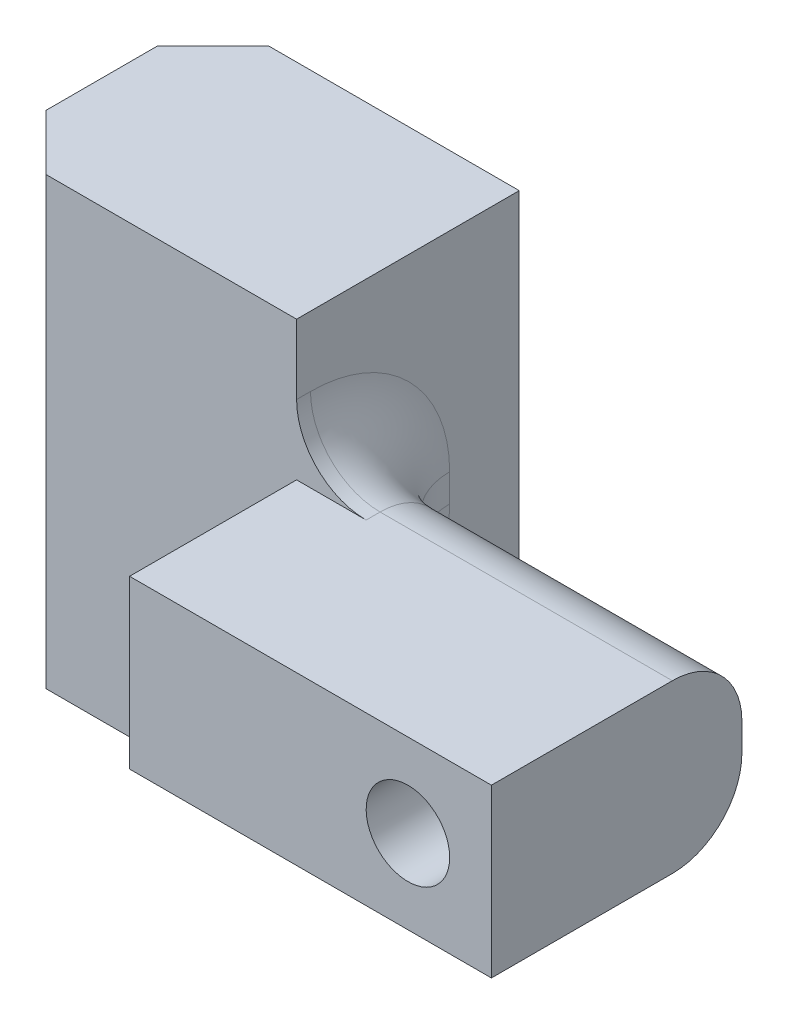
ISO-10303-21;
HEADER;
FILE_DESCRIPTION(('STEP AP214'),'2;1');
FILE_NAME('part.step','',(''),(''),'','','');
FILE_SCHEMA(('AUTOMOTIVE_DESIGN { 1 0 10303 214 1 1 1 1 }'));
ENDSEC;
DATA;
#1=APPLICATION_CONTEXT('core data for automotive mechanical design processes');
#2=APPLICATION_PROTOCOL_DEFINITION('international standard','automotive_design',2000,#1);
#3=PRODUCT_CONTEXT('',#1,'mechanical');
#4=PRODUCT('Part','Part','',(#3));
#5=PRODUCT_RELATED_PRODUCT_CATEGORY('part','',(#4));
#6=PRODUCT_DEFINITION_FORMATION('','',#4);
#7=PRODUCT_DEFINITION_CONTEXT('part definition',#1,'design');
#8=PRODUCT_DEFINITION('design','',#6,#7);
#9=PRODUCT_DEFINITION_SHAPE('','',#8);
#10=(LENGTH_UNIT() NAMED_UNIT(*) SI_UNIT(.MILLI.,.METRE.));
#11=(NAMED_UNIT(*) PLANE_ANGLE_UNIT() SI_UNIT($,.RADIAN.));
#12=(NAMED_UNIT(*) SI_UNIT($,.STERADIAN.) SOLID_ANGLE_UNIT());
#13=UNCERTAINTY_MEASURE_WITH_UNIT(LENGTH_MEASURE(1.E-05),#10,'distance_accuracy_value','');
#14=(GEOMETRIC_REPRESENTATION_CONTEXT(3) GLOBAL_UNCERTAINTY_ASSIGNED_CONTEXT((#13)) GLOBAL_UNIT_ASSIGNED_CONTEXT((#10,
#11,#12)) REPRESENTATION_CONTEXT('',''));
#15=CARTESIAN_POINT('',(0.,0.,0.));
#16=DIRECTION('',(0.,0.,1.));
#17=DIRECTION('',(1.,0.,0.));
#18=AXIS2_PLACEMENT_3D('',#15,#16,#17);
#19=CARTESIAN_POINT('',(0.,0.,0.));
#20=DIRECTION('',(0.,0.,-1.));
#21=DIRECTION('',(-1.,0.,0.));
#22=AXIS2_PLACEMENT_3D('',#19,#20,#21);
#23=PLANE('',#22);
#24=CARTESIAN_POINT('',(0.,0.,0.));
#25=DIRECTION('',(0.,0.,1.));
#26=DIRECTION('',(1.,0.,0.));
#27=AXIS2_PLACEMENT_3D('',#24,#25,#26);
#28=CIRCLE('',#27,1.5);
#29=CARTESIAN_POINT('',(1.41421356237309,-0.5,0.));
#30=VERTEX_POINT('',#29);
#31=CARTESIAN_POINT('',(1.41421356237309,0.500000000000001,0.));
#32=VERTEX_POINT('',#31);
#33=EDGE_CURVE('E211',#30,#32,#28,.T.);
#34=ORIENTED_EDGE('',*,*,#33,.T.);
#35=DIRECTION('',(-1.,0.,0.));
#36=VECTOR('',#35,1.);
#37=CARTESIAN_POINT('',(3.,0.500000000000001,0.));
#38=LINE('',#37,#36);
#39=CARTESIAN_POINT('',(3.,0.500000000000001,0.));
#40=VERTEX_POINT('',#39);
#41=EDGE_CURVE('E277',#32,#40,#38,.F.);
#42=ORIENTED_EDGE('',*,*,#41,.T.);
#43=DIRECTION('',(0.,1.,0.));
#44=VECTOR('',#43,1.);
#45=CARTESIAN_POINT('',(3.,-3.,0.));
#46=LINE('',#45,#44);
#47=CARTESIAN_POINT('',(3.,-0.5,0.));
#48=VERTEX_POINT('',#47);
#49=EDGE_CURVE('E216',#48,#40,#46,.T.);
#50=ORIENTED_EDGE('',*,*,#49,.F.);
#51=DIRECTION('',(1.,0.,0.));
#52=VECTOR('',#51,1.);
#53=CARTESIAN_POINT('',(-10.,-0.5,0.));
#54=LINE('',#53,#52);
#55=EDGE_CURVE('E275',#48,#30,#54,.F.);
#56=ORIENTED_EDGE('',*,*,#55,.T.);
#57=EDGE_LOOP('',(#34,#42,#50,#56));
#58=FACE_BOUND('',#57,.T.);
#59=ADVANCED_FACE('F33',(#58),#23,.T.);
#60=CARTESIAN_POINT('',(0.,0.,9.));
#61=DIRECTION('',(0.,0.,-1.));
#62=DIRECTION('',(-1.,0.,0.));
#63=AXIS2_PLACEMENT_3D('',#60,#61,#62);
#64=PLANE('',#63);
#65=DIRECTION('',(0.,1.,0.));
#66=VECTOR('',#65,1.);
#67=CARTESIAN_POINT('',(3.,-3.,9.));
#68=LINE('',#67,#66);
#69=CARTESIAN_POINT('',(3.,-3.,9.));
#70=VERTEX_POINT('',#69);
#71=CARTESIAN_POINT('',(3.,3.,9.));
#72=VERTEX_POINT('',#71);
#73=EDGE_CURVE('E220',#70,#72,#68,.T.);
#74=ORIENTED_EDGE('',*,*,#73,.T.);
#75=DIRECTION('',(-1.,0.,0.));
#76=VECTOR('',#75,1.);
#77=CARTESIAN_POINT('',(-3.,3.,9.));
#78=LINE('',#77,#76);
#79=CARTESIAN_POINT('',(-10.,3.,9.));
#80=VERTEX_POINT('',#79);
#81=EDGE_CURVE('E223',#72,#80,#78,.T.);
#82=ORIENTED_EDGE('',*,*,#81,.T.);
#83=DIRECTION('',(0.,-1.,0.));
#84=VECTOR('',#83,1.);
#85=CARTESIAN_POINT('',(-10.,3.,9.));
#86=LINE('',#85,#84);
#87=CARTESIAN_POINT('',(-10.,-3.,9.));
#88=VERTEX_POINT('',#87);
#89=EDGE_CURVE('E225',#80,#88,#86,.T.);
#90=ORIENTED_EDGE('',*,*,#89,.T.);
#91=DIRECTION('',(1.,0.,0.));
#92=VECTOR('',#91,1.);
#93=CARTESIAN_POINT('',(-3.,-3.,9.));
#94=LINE('',#93,#92);
#95=EDGE_CURVE('E227',#88,#70,#94,.T.);
#96=ORIENTED_EDGE('',*,*,#95,.T.);
#97=EDGE_LOOP('',(#74,#82,#90,#96));
#98=FACE_BOUND('',#97,.T.);
#99=CARTESIAN_POINT('',(0.,0.,9.));
#100=DIRECTION('',(0.,0.,1.));
#101=DIRECTION('',(1.,0.,0.));
#102=AXIS2_PLACEMENT_3D('',#99,#100,#101);
#103=CIRCLE('',#102,1.5);
#104=CARTESIAN_POINT('',(1.5,0.,9.));
#105=VERTEX_POINT('',#104);
#106=EDGE_CURVE('E213',#105,#105,#103,.T.);
#107=ORIENTED_EDGE('',*,*,#106,.F.);
#108=EDGE_LOOP('',(#107));
#109=FACE_BOUND('',#108,.T.);
#110=ADVANCED_FACE('F321',(#98,#109),#64,.F.);
#111=DIRECTION('',(0.,-1.,0.));
#112=VECTOR('',#111,1.);
#113=CARTESIAN_POINT('',(-7.5,3.,0.));
#114=LINE('',#113,#112);
#115=CARTESIAN_POINT('',(-7.5,-0.5,0.));
#116=VERTEX_POINT('',#115);
#117=CARTESIAN_POINT('',(-7.5,0.499999999999999,0.));
#118=VERTEX_POINT('',#117);
#119=EDGE_CURVE('E269',#116,#118,#114,.F.);
#120=ORIENTED_EDGE('',*,*,#119,.T.);
#121=DIRECTION('',(-1.,0.,0.));
#122=VECTOR('',#121,1.);
#123=CARTESIAN_POINT('',(3.,0.500000000000001,0.));
#124=LINE('',#123,#122);
#125=CARTESIAN_POINT('',(-1.41421356237309,0.5,0.));
#126=VERTEX_POINT('',#125);
#127=EDGE_CURVE('E273',#118,#126,#124,.F.);
#128=ORIENTED_EDGE('',*,*,#127,.T.);
#129=CARTESIAN_POINT('',(-1.41421356237309,-0.5,0.));
#130=VERTEX_POINT('',#129);
#131=EDGE_CURVE('E217',#126,#130,#28,.T.);
#132=ORIENTED_EDGE('',*,*,#131,.T.);
#133=DIRECTION('',(1.,0.,0.));
#134=VECTOR('',#133,1.);
#135=CARTESIAN_POINT('',(-10.,-0.5,0.));
#136=LINE('',#135,#134);
#137=EDGE_CURVE('E271',#130,#116,#136,.F.);
#138=ORIENTED_EDGE('',*,*,#137,.T.);
#139=EDGE_LOOP('',(#120,#128,#132,#138));
#140=FACE_BOUND('',#139,.T.);
#141=ADVANCED_FACE('F324',(#140),#23,.T.);
#142=CARTESIAN_POINT('',(3.,-3.,9.));
#143=DIRECTION('',(-1.,0.,0.));
#144=DIRECTION('',(0.,0.,1.));
#145=AXIS2_PLACEMENT_3D('',#142,#143,#144);
#146=PLANE('',#145);
#147=ORIENTED_EDGE('',*,*,#49,.T.);
#148=CARTESIAN_POINT('',(3.,0.500000000000001,2.5));
#149=DIRECTION('',(-1.,0.,0.));
#150=DIRECTION('',(0.,0.,1.));
#151=AXIS2_PLACEMENT_3D('',#148,#149,#150);
#152=CIRCLE('',#151,2.5);
#153=CARTESIAN_POINT('',(3.,3.,2.5));
#154=VERTEX_POINT('',#153);
#155=EDGE_CURVE('E399',#40,#154,#152,.F.);
#156=ORIENTED_EDGE('',*,*,#155,.T.);
#157=DIRECTION('',(0.,0.,-1.));
#158=VECTOR('',#157,1.);
#159=CARTESIAN_POINT('',(3.,3.,9.));
#160=LINE('',#159,#158);
#161=EDGE_CURVE('E240',#72,#154,#160,.T.);
#162=ORIENTED_EDGE('',*,*,#161,.F.);
#163=ORIENTED_EDGE('',*,*,#73,.F.);
#164=DIRECTION('',(0.,0.,-1.));
#165=VECTOR('',#164,1.);
#166=CARTESIAN_POINT('',(3.,-3.,9.));
#167=LINE('',#166,#165);
#168=CARTESIAN_POINT('',(3.,-3.,2.5));
#169=VERTEX_POINT('',#168);
#170=EDGE_CURVE('E229',#70,#169,#167,.T.);
#171=ORIENTED_EDGE('',*,*,#170,.T.);
#172=CARTESIAN_POINT('',(3.,-0.5,2.5));
#173=DIRECTION('',(-1.,0.,0.));
#174=DIRECTION('',(0.,0.,1.));
#175=AXIS2_PLACEMENT_3D('',#172,#173,#174);
#176=CIRCLE('',#175,2.5);
#177=EDGE_CURVE('E402',#169,#48,#176,.F.);
#178=ORIENTED_EDGE('',*,*,#177,.T.);
#179=EDGE_LOOP('',(#147,#156,#162,#163,#171,#178));
#180=FACE_BOUND('',#179,.T.);
#181=ADVANCED_FACE('F331',(#180),#146,.F.);
#182=CARTESIAN_POINT('',(-3.,3.,9.));
#183=DIRECTION('',(0.,-1.,0.));
#184=DIRECTION('',(1.,0.,0.));
#185=AXIS2_PLACEMENT_3D('',#182,#183,#184);
#186=PLANE('',#185);
#187=DIRECTION('',(0.,0.,-1.));
#188=VECTOR('',#187,1.);
#189=CARTESIAN_POINT('',(-7.5,3.,9.));
#190=LINE('',#189,#188);
#191=CARTESIAN_POINT('',(-7.5,3.,2.5));
#192=VERTEX_POINT('',#191);
#193=CARTESIAN_POINT('',(-7.5,3.,3.));
#194=VERTEX_POINT('',#193);
#195=EDGE_CURVE('E257',#192,#194,#190,.F.);
#196=ORIENTED_EDGE('',*,*,#195,.T.);
#197=DIRECTION('',(-1.,0.,0.));
#198=VECTOR('',#197,1.);
#199=CARTESIAN_POINT('',(-3.,3.,3.));
#200=LINE('',#199,#198);
#201=CARTESIAN_POINT('',(-10.,3.,3.));
#202=VERTEX_POINT('',#201);
#203=EDGE_CURVE('E260',#194,#202,#200,.T.);
#204=ORIENTED_EDGE('',*,*,#203,.T.);
#205=DIRECTION('',(0.,0.,-1.));
#206=VECTOR('',#205,1.);
#207=CARTESIAN_POINT('',(-10.,3.,9.));
#208=LINE('',#207,#206);
#209=EDGE_CURVE('E237',#80,#202,#208,.T.);
#210=ORIENTED_EDGE('',*,*,#209,.F.);
#211=ORIENTED_EDGE('',*,*,#81,.F.);
#212=ORIENTED_EDGE('',*,*,#161,.T.);
#213=DIRECTION('',(-1.,0.,0.));
#214=VECTOR('',#213,1.);
#215=CARTESIAN_POINT('',(-10.,3.,2.5));
#216=LINE('',#215,#214);
#217=EDGE_CURVE('E255',#154,#192,#216,.T.);
#218=ORIENTED_EDGE('',*,*,#217,.T.);
#219=EDGE_LOOP('',(#196,#204,#210,#211,#212,#218));
#220=FACE_BOUND('',#219,.T.);
#221=ADVANCED_FACE('F336',(#220),#186,.F.);
#222=CARTESIAN_POINT('',(-10.,3.,9.));
#223=DIRECTION('',(1.,0.,0.));
#224=DIRECTION('',(0.,0.,-1.));
#225=AXIS2_PLACEMENT_3D('',#222,#223,#224);
#226=PLANE('',#225);
#227=ORIENTED_EDGE('',*,*,#209,.T.);
#228=DIRECTION('',(0.,-1.,0.));
#229=VECTOR('',#228,1.);
#230=CARTESIAN_POINT('',(-10.,8.,3.));
#231=LINE('',#230,#229);
#232=CARTESIAN_POINT('',(-10.,-3.,3.));
#233=VERTEX_POINT('',#232);
#234=EDGE_CURVE('E181',#202,#233,#231,.T.);
#235=ORIENTED_EDGE('',*,*,#234,.T.);
#236=DIRECTION('',(0.,0.,-1.));
#237=VECTOR('',#236,1.);
#238=CARTESIAN_POINT('',(-10.,-3.,9.));
#239=LINE('',#238,#237);
#240=EDGE_CURVE('E234',#88,#233,#239,.T.);
#241=ORIENTED_EDGE('',*,*,#240,.F.);
#242=ORIENTED_EDGE('',*,*,#89,.F.);
#243=EDGE_LOOP('',(#227,#235,#241,#242));
#244=FACE_BOUND('',#243,.T.);
#245=ADVANCED_FACE('F425',(#244),#226,.F.);
#246=CARTESIAN_POINT('',(-3.,-3.,9.));
#247=DIRECTION('',(0.,1.,0.));
#248=DIRECTION('',(0.,0.,1.));
#249=AXIS2_PLACEMENT_3D('',#246,#247,#248);
#250=PLANE('',#249);
#251=ORIENTED_EDGE('',*,*,#240,.T.);
#252=DIRECTION('',(1.,0.,0.));
#253=VECTOR('',#252,1.);
#254=CARTESIAN_POINT('',(-3.,-3.,3.));
#255=LINE('',#254,#253);
#256=CARTESIAN_POINT('',(-7.5,-3.,3.));
#257=VERTEX_POINT('',#256);
#258=EDGE_CURVE('E266',#233,#257,#255,.T.);
#259=ORIENTED_EDGE('',*,*,#258,.T.);
#260=DIRECTION('',(0.,0.,-1.));
#261=VECTOR('',#260,1.);
#262=CARTESIAN_POINT('',(-7.5,-3.,9.));
#263=LINE('',#262,#261);
#264=CARTESIAN_POINT('',(-7.5,-3.,2.5));
#265=VERTEX_POINT('',#264);
#266=EDGE_CURVE('E264',#257,#265,#263,.T.);
#267=ORIENTED_EDGE('',*,*,#266,.T.);
#268=DIRECTION('',(1.,0.,0.));
#269=VECTOR('',#268,1.);
#270=CARTESIAN_POINT('',(3.,-3.,2.5));
#271=LINE('',#270,#269);
#272=EDGE_CURVE('E262',#265,#169,#271,.T.);
#273=ORIENTED_EDGE('',*,*,#272,.T.);
#274=ORIENTED_EDGE('',*,*,#170,.F.);
#275=ORIENTED_EDGE('',*,*,#95,.F.);
#276=EDGE_LOOP('',(#251,#259,#267,#273,#274,#275));
#277=FACE_BOUND('',#276,.T.);
#278=ADVANCED_FACE('F420',(#277),#250,.F.);
#279=CARTESIAN_POINT('',(0.,0.,9.));
#280=DIRECTION('',(0.,0.,-1.));
#281=DIRECTION('',(-1.,0.,0.));
#282=AXIS2_PLACEMENT_3D('',#279,#280,#281);
#283=CYLINDRICAL_SURFACE('',#282,1.5);
#284=ORIENTED_EDGE('',*,*,#106,.T.);
#285=EDGE_LOOP('',(#284));
#286=FACE_BOUND('',#285,.T.);
#287=ORIENTED_EDGE('',*,*,#131,.F.);
#288=CARTESIAN_POINT('',(-1.41421356237309,0.5,0.));
#289=CARTESIAN_POINT('',(-1.40068490551128,0.538271973644592,-3.79228077458756E-06));
#290=CARTESIAN_POINT('',(-1.38560656395206,0.57596691927819,0.000879386960323828));
#291=CARTESIAN_POINT('',(-1.352489948732,0.649931726041284,0.00422623898738818));
#292=CARTESIAN_POINT('',(-1.33445366647011,0.686202525736818,0.00668885166297183));
#293=CARTESIAN_POINT('',(-1.27628655988678,0.792183936408507,0.0161255411330627));
#294=CARTESIAN_POINT('',(-1.23195554242356,0.859462101938222,0.0251524664692449));
#295=CARTESIAN_POINT('',(-1.13362447903287,0.985539558468354,0.0467675682198267));
#296=CARTESIAN_POINT('',(-1.07964505952963,1.04435646315281,0.0593481801966038));
#297=CARTESIAN_POINT('',(-0.963203675156425,1.15263444597581,0.0860444435075559));
#298=CARTESIAN_POINT('',(-0.900730440635611,1.2020828817345,0.100162129198513));
#299=CARTESIAN_POINT('',(-0.764450973735891,1.29335220199358,0.128707682812287));
#300=CARTESIAN_POINT('',(-0.690176900481489,1.33448892593512,0.143098276204687));
#301=CARTESIAN_POINT('',(-0.53531740028397,1.4037885848032,0.168790026119004));
#302=CARTESIAN_POINT('',(-0.454735067362417,1.43195783383457,0.180092685121426));
#303=CARTESIAN_POINT('',(-0.290623256730034,1.47397449872099,0.197416449625339));
#304=CARTESIAN_POINT('',(-0.20715507550835,1.48802777831301,0.203513272350837));
#305=CARTESIAN_POINT('',(-0.0388421420453783,1.50186944018671,0.209515062956219));
#306=CARTESIAN_POINT('',(0.0460018604760755,1.5016653467265,0.209423296834148));
#307=CARTESIAN_POINT('',(0.207838984007759,1.4875827031024,0.203323244746921));
#308=CARTESIAN_POINT('',(0.284942166815956,1.47473509814137,0.197761036918077));
#309=CARTESIAN_POINT('',(0.435817617824731,1.43739562255224,0.182308649259037));
#310=CARTESIAN_POINT('',(0.509589003163167,1.41290068519868,0.172417329634692));
#311=CARTESIAN_POINT('',(0.653987497984677,1.35225647265139,0.149525313944966));
#312=CARTESIAN_POINT('',(0.724479588704687,1.31581572133426,0.136449206087986));
#313=CARTESIAN_POINT('',(0.858760642687472,1.23238960311594,0.109283207519285));
#314=CARTESIAN_POINT('',(0.922544451969805,1.1853962142658,0.095192551129074));
#315=CARTESIAN_POINT('',(1.04665379074477,1.0778526028082,0.0670167201880152));
#316=CARTESIAN_POINT('',(1.10633967354066,1.01653942928296,0.0530147230091779));
#317=CARTESIAN_POINT('',(1.21464600334003,0.884256611329298,0.0287979494723417));
#318=CARTESIAN_POINT('',(1.26328804856941,0.813306256387879,0.018575755963619));
#319=CARTESIAN_POINT('',(1.32707943248037,0.700551955483497,0.00776354518726424));
#320=CARTESIAN_POINT('',(1.34693849236152,0.661566085442509,0.00490875164663716));
#321=CARTESIAN_POINT('',(1.3832044241059,0.581944933959037,0.00102452960814464));
#322=CARTESIAN_POINT('',(1.39961200512392,0.541309993392039,-5.2741829561241E-06));
#323=CARTESIAN_POINT('',(1.41421356237309,0.500000000000001,0.));
#324=B_SPLINE_CURVE_WITH_KNOTS('',3,(#288,#289,#290,#291,#292,#293,#294,#295,#296,#297,#298,
#299,#300,#301,#302,#303,#304,#305,#306,#307,#308,#309,#310,#311,#312,#313,#314,#315,#316,#317,
#318,#319,#320,#321,#322,#323),.UNSPECIFIED.,.F.,.F.,(4,2,2,2,2,2,2,2,2,2,2,2,2,2,2,2,2,4),(0.,
0.121685157507987,0.243288725701847,0.485244478719881,0.726689032272145,0.968457120527421,
1.22558482805404,1.48258720254105,1.73578459287207,1.98884836054248,2.22285455445689,
2.45692239600332,2.6971893681086,2.93763960944022,3.19651719124193,3.45488404433781,
3.58623877948295,3.71756649953589),.UNSPECIFIED.);
#325=EDGE_CURVE('E286',#126,#32,#324,.T.);
#326=ORIENTED_EDGE('',*,*,#325,.T.);
#327=ORIENTED_EDGE('',*,*,#33,.F.);
#328=CARTESIAN_POINT('',(1.41421356237309,-0.5,0.));
#329=CARTESIAN_POINT('',(1.40068490551128,-0.538271973644592,-3.79228077499397E-06));
#330=CARTESIAN_POINT('',(1.38560656395206,-0.57596691927819,0.000879386960323389));
#331=CARTESIAN_POINT('',(1.352489948732,-0.649931726041284,0.00422623898738794));
#332=CARTESIAN_POINT('',(1.33445366647011,-0.686202525736818,0.00668885166297182));
#333=CARTESIAN_POINT('',(1.27628655988678,-0.792183936408507,0.0161255411330631));
#334=CARTESIAN_POINT('',(1.23195554242356,-0.859462101938222,0.025152466469245));
#335=CARTESIAN_POINT('',(1.13362447903287,-0.985539558468354,0.0467675682198265));
#336=CARTESIAN_POINT('',(1.07964505952963,-1.04435646315281,0.0593481801966037));
#337=CARTESIAN_POINT('',(0.963203675156425,-1.15263444597581,0.0860444435075559));
#338=CARTESIAN_POINT('',(0.900730440635611,-1.2020828817345,0.100162129198513));
#339=CARTESIAN_POINT('',(0.764450973735891,-1.29335220199358,0.128707682812287));
#340=CARTESIAN_POINT('',(0.690176900481489,-1.33448892593512,0.143098276204687));
#341=CARTESIAN_POINT('',(0.535317400283971,-1.4037885848032,0.168790026119004));
#342=CARTESIAN_POINT('',(0.454735067362418,-1.43195783383457,0.180092685121426));
#343=CARTESIAN_POINT('',(0.290623256730035,-1.47397449872099,0.197416449625339));
#344=CARTESIAN_POINT('',(0.20715507550835,-1.48802777831301,0.203513272350837));
#345=CARTESIAN_POINT('',(0.0388421420453791,-1.50186944018671,0.209515062956219));
#346=CARTESIAN_POINT('',(-0.0460018604760747,-1.5016653467265,0.209423296834149));
#347=CARTESIAN_POINT('',(-0.207838984007759,-1.4875827031024,0.203323244746922));
#348=CARTESIAN_POINT('',(-0.284942166815955,-1.47473509814137,0.197761036918077));
#349=CARTESIAN_POINT('',(-0.43581761782473,-1.43739562255224,0.182308649259038));
#350=CARTESIAN_POINT('',(-0.509589003163166,-1.41290068519868,0.172417329634692));
#351=CARTESIAN_POINT('',(-0.653987497984676,-1.35225647265139,0.149525313944967));
#352=CARTESIAN_POINT('',(-0.724479588704686,-1.31581572133426,0.136449206087986));
#353=CARTESIAN_POINT('',(-0.858760642687471,-1.23238960311594,0.109283207519285));
#354=CARTESIAN_POINT('',(-0.922544451969804,-1.1853962142658,0.0951925511290743));
#355=CARTESIAN_POINT('',(-1.04665379074477,-1.0778526028082,0.0670167201880158));
#356=CARTESIAN_POINT('',(-1.10633967354066,-1.01653942928296,0.0530147230091785));
#357=CARTESIAN_POINT('',(-1.21464600334003,-0.884256611329299,0.0287979494723419));
#358=CARTESIAN_POINT('',(-1.26328804856941,-0.813306256387879,0.0185757559636188));
#359=CARTESIAN_POINT('',(-1.32707943248037,-0.700551955483497,0.0077635451872639));
#360=CARTESIAN_POINT('',(-1.34693849236152,-0.661566085442509,0.00490875164663688));
#361=CARTESIAN_POINT('',(-1.3832044241059,-0.581944933959037,0.0010245296081446));
#362=CARTESIAN_POINT('',(-1.39961200512392,-0.541309993392038,-5.27418295598332E-06));
#363=CARTESIAN_POINT('',(-1.41421356237309,-0.5,0.));
#364=B_SPLINE_CURVE_WITH_KNOTS('',3,(#328,#329,#330,#331,#332,#333,#334,#335,#336,#337,#338,
#339,#340,#341,#342,#343,#344,#345,#346,#347,#348,#349,#350,#351,#352,#353,#354,#355,#356,#357,
#358,#359,#360,#361,#362,#363),.UNSPECIFIED.,.F.,.F.,(4,2,2,2,2,2,2,2,2,2,2,2,2,2,2,2,2,4),(0.,
0.121685157507987,0.243288725701847,0.485244478719881,0.726689032272145,0.968457120527421,
1.22558482805404,1.48258720254105,1.73578459287207,1.98884836054248,2.22285455445689,
2.45692239600332,2.6971893681086,2.93763960944022,3.19651719124192,3.45488404433781,
3.58623877948295,3.71756649953589),.UNSPECIFIED.);
#365=EDGE_CURVE('E279',#30,#130,#364,.T.);
#366=ORIENTED_EDGE('',*,*,#365,.T.);
#367=EDGE_LOOP('',(#287,#326,#327,#366));
#368=FACE_BOUND('',#367,.T.);
#369=ADVANCED_FACE('F292',(#286,#368),#283,.F.);
#370=CARTESIAN_POINT('',(-10.,8.,3.));
#371=DIRECTION('',(1.,0.,0.));
#372=DIRECTION('',(0.,0.,-1.));
#373=AXIS2_PLACEMENT_3D('',#370,#371,#372);
#374=PLANE('',#373);
#375=CARTESIAN_POINT('',(-10.,8.,3.));
#376=VERTEX_POINT('',#375);
#377=CARTESIAN_POINT('',(-10.,5.5,3.));
#378=VERTEX_POINT('',#377);
#379=EDGE_CURVE('E178',#376,#378,#231,.T.);
#380=ORIENTED_EDGE('',*,*,#379,.T.);
#381=DIRECTION('',(0.,0.,-1.));
#382=VECTOR('',#381,1.);
#383=CARTESIAN_POINT('',(-10.,5.5,3.));
#384=LINE('',#383,#382);
#385=CARTESIAN_POINT('',(-10.,5.5,2.5));
#386=VERTEX_POINT('',#385);
#387=EDGE_CURVE('E252',#378,#386,#384,.T.);
#388=ORIENTED_EDGE('',*,*,#387,.T.);
#389=CARTESIAN_POINT('',(-10.,0.499999999999999,2.5));
#390=DIRECTION('',(1.,0.,0.));
#391=DIRECTION('',(0.,0.,-1.));
#392=AXIS2_PLACEMENT_3D('',#389,#390,#391);
#393=CIRCLE('',#392,5.);
#394=CARTESIAN_POINT('',(-10.,0.499999999999999,-2.5));
#395=VERTEX_POINT('',#394);
#396=EDGE_CURVE('E249',#395,#386,#393,.T.);
#397=ORIENTED_EDGE('',*,*,#396,.F.);
#398=DIRECTION('',(0.,-1.,0.));
#399=VECTOR('',#398,1.);
#400=CARTESIAN_POINT('',(-10.,-3.,-2.5));
#401=LINE('',#400,#399);
#402=CARTESIAN_POINT('',(-10.,-0.5,-2.5));
#403=VERTEX_POINT('',#402);
#404=EDGE_CURVE('E246',#395,#403,#401,.T.);
#405=ORIENTED_EDGE('',*,*,#404,.T.);
#406=CARTESIAN_POINT('',(-10.,-0.5,2.5));
#407=DIRECTION('',(1.,0.,0.));
#408=DIRECTION('',(0.,0.,-1.));
#409=AXIS2_PLACEMENT_3D('',#406,#407,#408);
#410=CIRCLE('',#409,5.);
#411=CARTESIAN_POINT('',(-10.,-5.5,2.5));
#412=VERTEX_POINT('',#411);
#413=EDGE_CURVE('E243',#412,#403,#410,.T.);
#414=ORIENTED_EDGE('',*,*,#413,.F.);
#415=DIRECTION('',(0.,0.,-1.));
#416=VECTOR('',#415,1.);
#417=CARTESIAN_POINT('',(-10.,-5.5,3.));
#418=LINE('',#417,#416);
#419=CARTESIAN_POINT('',(-10.,-5.5,3.));
#420=VERTEX_POINT('',#419);
#421=EDGE_CURVE('E175',#412,#420,#418,.F.);
#422=ORIENTED_EDGE('',*,*,#421,.T.);
#423=CARTESIAN_POINT('',(-10.,-8.,3.));
#424=VERTEX_POINT('',#423);
#425=EDGE_CURVE('E167',#420,#424,#231,.T.);
#426=ORIENTED_EDGE('',*,*,#425,.T.);
#427=DIRECTION('',(0.,0.,1.));
#428=VECTOR('',#427,1.);
#429=CARTESIAN_POINT('',(-10.,-8.,3.));
#430=LINE('',#429,#428);
#431=CARTESIAN_POINT('',(-10.,-8.,-5.));
#432=VERTEX_POINT('',#431);
#433=EDGE_CURVE('E173',#432,#424,#430,.T.);
#434=ORIENTED_EDGE('',*,*,#433,.F.);
#435=DIRECTION('',(0.,-1.,0.));
#436=VECTOR('',#435,1.);
#437=CARTESIAN_POINT('',(-10.,8.,-5.));
#438=LINE('',#437,#436);
#439=CARTESIAN_POINT('',(-10.,8.,-5.));
#440=VERTEX_POINT('',#439);
#441=EDGE_CURVE('E210',#440,#432,#438,.T.);
#442=ORIENTED_EDGE('',*,*,#441,.F.);
#443=DIRECTION('',(0.,0.,1.));
#444=VECTOR('',#443,1.);
#445=CARTESIAN_POINT('',(-10.,8.,3.));
#446=LINE('',#445,#444);
#447=EDGE_CURVE('E201',#440,#376,#446,.T.);
#448=ORIENTED_EDGE('',*,*,#447,.T.);
#449=EDGE_LOOP('',(#380,#388,#397,#405,#414,#422,#426,#434,#442,#448));
#450=FACE_BOUND('',#449,.T.);
#451=ADVANCED_FACE('F170',(#450),#374,.T.);
#452=CARTESIAN_POINT('',(-10.,8.,-5.));
#453=DIRECTION('',(0.,0.,-1.));
#454=DIRECTION('',(-1.,0.,0.));
#455=AXIS2_PLACEMENT_3D('',#452,#453,#454);
#456=PLANE('',#455);
#457=DIRECTION('',(1.,0.,0.));
#458=VECTOR('',#457,1.);
#459=CARTESIAN_POINT('',(-10.,-8.,-5.));
#460=LINE('',#459,#458);
#461=CARTESIAN_POINT('',(-19.,-8.,-5.));
#462=VERTEX_POINT('',#461);
#463=EDGE_CURVE('E191',#462,#432,#460,.T.);
#464=ORIENTED_EDGE('',*,*,#463,.F.);
#465=DIRECTION('',(0.,1.,0.));
#466=VECTOR('',#465,1.);
#467=CARTESIAN_POINT('',(-19.,8.,-5.));
#468=LINE('',#467,#466);
#469=CARTESIAN_POINT('',(-19.,8.,-5.));
#470=VERTEX_POINT('',#469);
#471=EDGE_CURVE('E56',#462,#470,#468,.T.);
#472=ORIENTED_EDGE('',*,*,#471,.T.);
#473=DIRECTION('',(1.,0.,0.));
#474=VECTOR('',#473,1.);
#475=CARTESIAN_POINT('',(-10.,8.,-5.));
#476=LINE('',#475,#474);
#477=EDGE_CURVE('E179',#470,#440,#476,.T.);
#478=ORIENTED_EDGE('',*,*,#477,.T.);
#479=ORIENTED_EDGE('',*,*,#441,.T.);
#480=EDGE_LOOP('',(#464,#472,#478,#479));
#481=FACE_BOUND('',#480,.T.);
#482=ADVANCED_FACE('F391',(#481),#456,.T.);
#483=CARTESIAN_POINT('',(-21.,8.,3.));
#484=DIRECTION('',(-1.,0.,0.));
#485=DIRECTION('',(0.,0.,1.));
#486=AXIS2_PLACEMENT_3D('',#483,#484,#485);
#487=PLANE('',#486);
#488=DIRECTION('',(0.,0.,-1.));
#489=VECTOR('',#488,1.);
#490=CARTESIAN_POINT('',(-21.,8.,3.));
#491=LINE('',#490,#489);
#492=CARTESIAN_POINT('',(-21.,8.,0.999999999999993));
#493=VERTEX_POINT('',#492);
#494=CARTESIAN_POINT('',(-21.,8.,-3.));
#495=VERTEX_POINT('',#494);
#496=EDGE_CURVE('E206',#493,#495,#491,.T.);
#497=ORIENTED_EDGE('',*,*,#496,.T.);
#498=DIRECTION('',(0.,-1.,0.));
#499=VECTOR('',#498,1.);
#500=CARTESIAN_POINT('',(-21.,8.,-3.));
#501=LINE('',#500,#499);
#502=CARTESIAN_POINT('',(-21.,-8.,-3.));
#503=VERTEX_POINT('',#502);
#504=EDGE_CURVE('E375',#495,#503,#501,.T.);
#505=ORIENTED_EDGE('',*,*,#504,.T.);
#506=DIRECTION('',(0.,0.,-1.));
#507=VECTOR('',#506,1.);
#508=CARTESIAN_POINT('',(-21.,-8.,3.));
#509=LINE('',#508,#507);
#510=CARTESIAN_POINT('',(-21.,-8.,0.999999999999993));
#511=VERTEX_POINT('',#510);
#512=EDGE_CURVE('E187',#511,#503,#509,.T.);
#513=ORIENTED_EDGE('',*,*,#512,.F.);
#514=DIRECTION('',(0.,1.,0.));
#515=VECTOR('',#514,1.);
#516=CARTESIAN_POINT('',(-21.,8.,0.999999999999993));
#517=LINE('',#516,#515);
#518=EDGE_CURVE('E373',#511,#493,#517,.T.);
#519=ORIENTED_EDGE('',*,*,#518,.T.);
#520=EDGE_LOOP('',(#497,#505,#513,#519));
#521=FACE_BOUND('',#520,.T.);
#522=ADVANCED_FACE('F388',(#521),#487,.T.);
#523=CARTESIAN_POINT('',(-10.,8.,3.));
#524=DIRECTION('',(0.,0.,1.));
#525=DIRECTION('',(1.,0.,0.));
#526=AXIS2_PLACEMENT_3D('',#523,#524,#525);
#527=PLANE('',#526);
#528=DIRECTION('',(-1.,0.,0.));
#529=VECTOR('',#528,1.);
#530=CARTESIAN_POINT('',(-10.,8.,3.));
#531=LINE('',#530,#529);
#532=CARTESIAN_POINT('',(-19.,8.,3.));
#533=VERTEX_POINT('',#532);
#534=EDGE_CURVE('E204',#376,#533,#531,.T.);
#535=ORIENTED_EDGE('',*,*,#534,.T.);
#536=DIRECTION('',(0.,-1.,0.));
#537=VECTOR('',#536,1.);
#538=CARTESIAN_POINT('',(-19.,8.,3.));
#539=LINE('',#538,#537);
#540=CARTESIAN_POINT('',(-19.,-8.,3.));
#541=VERTEX_POINT('',#540);
#542=EDGE_CURVE('E11',#533,#541,#539,.T.);
#543=ORIENTED_EDGE('',*,*,#542,.T.);
#544=DIRECTION('',(-1.,0.,0.));
#545=VECTOR('',#544,1.);
#546=CARTESIAN_POINT('',(-10.,-8.,3.));
#547=LINE('',#546,#545);
#548=EDGE_CURVE('E183',#424,#541,#547,.T.);
#549=ORIENTED_EDGE('',*,*,#548,.F.);
#550=ORIENTED_EDGE('',*,*,#425,.F.);
#551=CARTESIAN_POINT('',(-7.5,-5.5,3.));
#552=DIRECTION('',(0.,0.,1.));
#553=DIRECTION('',(1.,0.,0.));
#554=AXIS2_PLACEMENT_3D('',#551,#552,#553);
#555=CIRCLE('',#554,2.5);
#556=EDGE_CURVE('E376',#420,#257,#555,.F.);
#557=ORIENTED_EDGE('',*,*,#556,.T.);
#558=ORIENTED_EDGE('',*,*,#258,.F.);
#559=ORIENTED_EDGE('',*,*,#234,.F.);
#560=ORIENTED_EDGE('',*,*,#203,.F.);
#561=CARTESIAN_POINT('',(-7.5,5.5,3.));
#562=DIRECTION('',(0.,0.,1.));
#563=DIRECTION('',(1.,0.,0.));
#564=AXIS2_PLACEMENT_3D('',#561,#562,#563);
#565=CIRCLE('',#564,2.5);
#566=EDGE_CURVE('E393',#194,#378,#565,.F.);
#567=ORIENTED_EDGE('',*,*,#566,.T.);
#568=ORIENTED_EDGE('',*,*,#379,.F.);
#569=EDGE_LOOP('',(#535,#543,#549,#550,#557,#558,#559,#560,#567,#568));
#570=FACE_BOUND('',#569,.T.);
#571=ADVANCED_FACE('F184',(#570),#527,.T.);
#572=CARTESIAN_POINT('',(0.,8.,0.));
#573=DIRECTION('',(0.,1.,0.));
#574=DIRECTION('',(0.,0.,1.));
#575=AXIS2_PLACEMENT_3D('',#572,#573,#574);
#576=PLANE('',#575);
#577=ORIENTED_EDGE('',*,*,#477,.F.);
#578=DIRECTION('',(0.707106781186549,0.,-0.707106781186546));
#579=VECTOR('',#578,1.);
#580=CARTESIAN_POINT('',(-12.,8.,-12.));
#581=LINE('',#580,#579);
#582=EDGE_CURVE('E41',#470,#495,#581,.F.);
#583=ORIENTED_EDGE('',*,*,#582,.T.);
#584=ORIENTED_EDGE('',*,*,#496,.F.);
#585=DIRECTION('',(-0.707106781186546,0.,-0.707106781186549));
#586=VECTOR('',#585,1.);
#587=CARTESIAN_POINT('',(-11.,8.,11.));
#588=LINE('',#587,#586);
#589=EDGE_CURVE('E48',#493,#533,#588,.F.);
#590=ORIENTED_EDGE('',*,*,#589,.T.);
#591=ORIENTED_EDGE('',*,*,#534,.F.);
#592=ORIENTED_EDGE('',*,*,#447,.F.);
#593=EDGE_LOOP('',(#577,#583,#584,#590,#591,#592));
#594=FACE_BOUND('',#593,.T.);
#595=ADVANCED_FACE('F384',(#594),#576,.T.);
#596=CARTESIAN_POINT('',(0.,-8.,0.));
#597=DIRECTION('',(0.,1.,0.));
#598=DIRECTION('',(0.,0.,1.));
#599=AXIS2_PLACEMENT_3D('',#596,#597,#598);
#600=PLANE('',#599);
#601=ORIENTED_EDGE('',*,*,#512,.T.);
#602=DIRECTION('',(-0.707106781186549,0.,0.707106781186546));
#603=VECTOR('',#602,1.);
#604=CARTESIAN_POINT('',(-21.,-8.,-3.));
#605=LINE('',#604,#603);
#606=EDGE_CURVE('E381',#503,#462,#605,.F.);
#607=ORIENTED_EDGE('',*,*,#606,.T.);
#608=ORIENTED_EDGE('',*,*,#463,.T.);
#609=ORIENTED_EDGE('',*,*,#433,.T.);
#610=ORIENTED_EDGE('',*,*,#548,.T.);
#611=DIRECTION('',(0.707106781186546,0.,0.707106781186549));
#612=VECTOR('',#611,1.);
#613=CARTESIAN_POINT('',(-19.,-8.,3.));
#614=LINE('',#613,#612);
#615=EDGE_CURVE('E379',#541,#511,#614,.F.);
#616=ORIENTED_EDGE('',*,*,#615,.T.);
#617=EDGE_LOOP('',(#601,#607,#608,#609,#610,#616));
#618=FACE_BOUND('',#617,.T.);
#619=ADVANCED_FACE('F190',(#618),#600,.F.);
#620=CARTESIAN_POINT('',(-7.5,-5.5,9.));
#621=DIRECTION('',(0.,0.,-1.));
#622=DIRECTION('',(-1.,0.,0.));
#623=AXIS2_PLACEMENT_3D('',#620,#621,#622);
#624=CYLINDRICAL_SURFACE('',#623,2.5);
#625=ORIENTED_EDGE('',*,*,#556,.F.);
#626=ORIENTED_EDGE('',*,*,#421,.F.);
#627=CARTESIAN_POINT('',(-7.5,-5.5,2.5));
#628=DIRECTION('',(0.,0.,1.));
#629=DIRECTION('',(1.,0.,0.));
#630=AXIS2_PLACEMENT_3D('',#627,#628,#629);
#631=CIRCLE('',#630,2.5);
#632=EDGE_CURVE('E193',#265,#412,#631,.T.);
#633=ORIENTED_EDGE('',*,*,#632,.F.);
#634=ORIENTED_EDGE('',*,*,#266,.F.);
#635=EDGE_LOOP('',(#625,#626,#633,#634));
#636=FACE_BOUND('',#635,.T.);
#637=ADVANCED_FACE('F302',(#636),#624,.F.);
#638=CARTESIAN_POINT('',(-3.,-0.5,2.5));
#639=DIRECTION('',(-1.,0.,0.));
#640=DIRECTION('',(0.,0.,1.));
#641=AXIS2_PLACEMENT_3D('',#638,#639,#640);
#642=CYLINDRICAL_SURFACE('',#641,2.5);
#643=ORIENTED_EDGE('',*,*,#177,.F.);
#644=ORIENTED_EDGE('',*,*,#272,.F.);
#645=CARTESIAN_POINT('',(-7.5,-0.5,2.5));
#646=DIRECTION('',(1.,0.,0.));
#647=DIRECTION('',(0.,0.,-1.));
#648=AXIS2_PLACEMENT_3D('',#645,#646,#647);
#649=CIRCLE('',#648,2.5);
#650=EDGE_CURVE('E196',#116,#265,#649,.F.);
#651=ORIENTED_EDGE('',*,*,#650,.F.);
#652=ORIENTED_EDGE('',*,*,#137,.F.);
#653=ORIENTED_EDGE('',*,*,#365,.F.);
#654=ORIENTED_EDGE('',*,*,#55,.F.);
#655=EDGE_LOOP('',(#643,#644,#651,#652,#653,#654));
#656=FACE_BOUND('',#655,.T.);
#657=ADVANCED_FACE('F296',(#656),#642,.T.);
#658=CARTESIAN_POINT('',(-7.5,-0.5,2.5));
#659=DIRECTION('',(1.,0.,0.));
#660=DIRECTION('',(0.,0.,-1.));
#661=AXIS2_PLACEMENT_3D('',#658,#659,#660);
#662=TOROIDAL_SURFACE('',#661,5.,2.5);
#663=ORIENTED_EDGE('',*,*,#632,.T.);
#664=ORIENTED_EDGE('',*,*,#413,.T.);
#665=CARTESIAN_POINT('',(-7.5,-0.5,-2.5));
#666=DIRECTION('',(0.,1.,0.));
#667=DIRECTION('',(0.,0.,1.));
#668=AXIS2_PLACEMENT_3D('',#665,#666,#667);
#669=CIRCLE('',#668,2.5);
#670=EDGE_CURVE('E362',#116,#403,#669,.F.);
#671=ORIENTED_EDGE('',*,*,#670,.F.);
#672=ORIENTED_EDGE('',*,*,#650,.T.);
#673=EDGE_LOOP('',(#663,#664,#671,#672));
#674=FACE_BOUND('',#673,.T.);
#675=ADVANCED_FACE('F301',(#674),#662,.F.);
#676=CARTESIAN_POINT('',(-7.5,8.,-2.5));
#677=DIRECTION('',(0.,1.,0.));
#678=DIRECTION('',(0.,0.,1.));
#679=AXIS2_PLACEMENT_3D('',#676,#677,#678);
#680=CYLINDRICAL_SURFACE('',#679,2.5);
#681=ORIENTED_EDGE('',*,*,#670,.T.);
#682=ORIENTED_EDGE('',*,*,#404,.F.);
#683=CARTESIAN_POINT('',(-7.5,0.499999999999999,-2.5));
#684=DIRECTION('',(0.,-1.,0.));
#685=DIRECTION('',(0.,0.,-1.));
#686=AXIS2_PLACEMENT_3D('',#683,#684,#685);
#687=CIRCLE('',#686,2.5);
#688=EDGE_CURVE('E359',#118,#395,#687,.T.);
#689=ORIENTED_EDGE('',*,*,#688,.F.);
#690=ORIENTED_EDGE('',*,*,#119,.F.);
#691=EDGE_LOOP('',(#681,#682,#689,#690));
#692=FACE_BOUND('',#691,.T.);
#693=ADVANCED_FACE('F360',(#692),#680,.F.);
#694=CARTESIAN_POINT('',(-3.,0.5,2.5));
#695=DIRECTION('',(1.,0.,0.));
#696=DIRECTION('',(0.,1.,0.));
#697=AXIS2_PLACEMENT_3D('',#694,#695,#696);
#698=CYLINDRICAL_SURFACE('',#697,2.5);
#699=ORIENTED_EDGE('',*,*,#325,.F.);
#700=ORIENTED_EDGE('',*,*,#127,.F.);
#701=CARTESIAN_POINT('',(-7.5,0.499999999999999,2.5));
#702=DIRECTION('',(1.,0.,0.));
#703=DIRECTION('',(0.,0.,-1.));
#704=AXIS2_PLACEMENT_3D('',#701,#702,#703);
#705=CIRCLE('',#704,2.5);
#706=EDGE_CURVE('E354',#192,#118,#705,.F.);
#707=ORIENTED_EDGE('',*,*,#706,.F.);
#708=ORIENTED_EDGE('',*,*,#217,.F.);
#709=ORIENTED_EDGE('',*,*,#155,.F.);
#710=ORIENTED_EDGE('',*,*,#41,.F.);
#711=EDGE_LOOP('',(#699,#700,#707,#708,#709,#710));
#712=FACE_BOUND('',#711,.T.);
#713=ADVANCED_FACE('F351',(#712),#698,.T.);
#714=CARTESIAN_POINT('',(-7.5,0.499999999999999,2.5));
#715=DIRECTION('',(1.,0.,0.));
#716=DIRECTION('',(0.,0.,-1.));
#717=AXIS2_PLACEMENT_3D('',#714,#715,#716);
#718=TOROIDAL_SURFACE('',#717,5.,2.5);
#719=ORIENTED_EDGE('',*,*,#688,.T.);
#720=ORIENTED_EDGE('',*,*,#396,.T.);
#721=CARTESIAN_POINT('',(-7.5,5.5,2.5));
#722=DIRECTION('',(0.,0.,1.));
#723=DIRECTION('',(1.,0.,0.));
#724=AXIS2_PLACEMENT_3D('',#721,#722,#723);
#725=CIRCLE('',#724,2.5);
#726=EDGE_CURVE('E365',#192,#386,#725,.F.);
#727=ORIENTED_EDGE('',*,*,#726,.F.);
#728=ORIENTED_EDGE('',*,*,#706,.T.);
#729=EDGE_LOOP('',(#719,#720,#727,#728));
#730=FACE_BOUND('',#729,.T.);
#731=ADVANCED_FACE('F316',(#730),#718,.F.);
#732=CARTESIAN_POINT('',(-7.5,5.5,3.));
#733=DIRECTION('',(0.,0.,-1.));
#734=DIRECTION('',(-1.,0.,0.));
#735=AXIS2_PLACEMENT_3D('',#732,#733,#734);
#736=CYLINDRICAL_SURFACE('',#735,2.5);
#737=ORIENTED_EDGE('',*,*,#566,.F.);
#738=ORIENTED_EDGE('',*,*,#195,.F.);
#739=ORIENTED_EDGE('',*,*,#726,.T.);
#740=ORIENTED_EDGE('',*,*,#387,.F.);
#741=EDGE_LOOP('',(#737,#738,#739,#740));
#742=FACE_BOUND('',#741,.T.);
#743=ADVANCED_FACE('F309',(#742),#736,.F.);
#744=CARTESIAN_POINT('',(-21.,8.,-3.));
#745=DIRECTION('',(0.707106781186546,0.,0.707106781186549));
#746=DIRECTION('',(0.,-1.,0.));
#747=AXIS2_PLACEMENT_3D('',#744,#745,#746);
#748=PLANE('',#747);
#749=ORIENTED_EDGE('',*,*,#582,.F.);
#750=ORIENTED_EDGE('',*,*,#471,.F.);
#751=ORIENTED_EDGE('',*,*,#606,.F.);
#752=ORIENTED_EDGE('',*,*,#504,.F.);
#753=EDGE_LOOP('',(#749,#750,#751,#752));
#754=FACE_BOUND('',#753,.T.);
#755=ADVANCED_FACE('F307',(#754),#748,.F.);
#756=CARTESIAN_POINT('',(-19.,8.,3.));
#757=DIRECTION('',(0.707106781186549,0.,-0.707106781186546));
#758=DIRECTION('',(0.,-1.,0.));
#759=AXIS2_PLACEMENT_3D('',#756,#757,#758);
#760=PLANE('',#759);
#761=ORIENTED_EDGE('',*,*,#589,.F.);
#762=ORIENTED_EDGE('',*,*,#518,.F.);
#763=ORIENTED_EDGE('',*,*,#615,.F.);
#764=ORIENTED_EDGE('',*,*,#542,.F.);
#765=EDGE_LOOP('',(#761,#762,#763,#764));
#766=FACE_BOUND('',#765,.T.);
#767=ADVANCED_FACE('F35',(#766),#760,.F.);
#768=CLOSED_SHELL('',(#59,#110,#141,#181,#221,#245,#278,#369,#451,#482,#522,#571,#595,#619,#637,
#657,#675,#693,#713,#731,#743,#755,#767));
#769=MANIFOLD_SOLID_BREP('B2',#768);
#770=ADVANCED_BREP_SHAPE_REPRESENTATION('',(#18,#769),#14);
#771=SHAPE_DEFINITION_REPRESENTATION(#9,#770);
ENDSEC;
END-ISO-10303-21;
